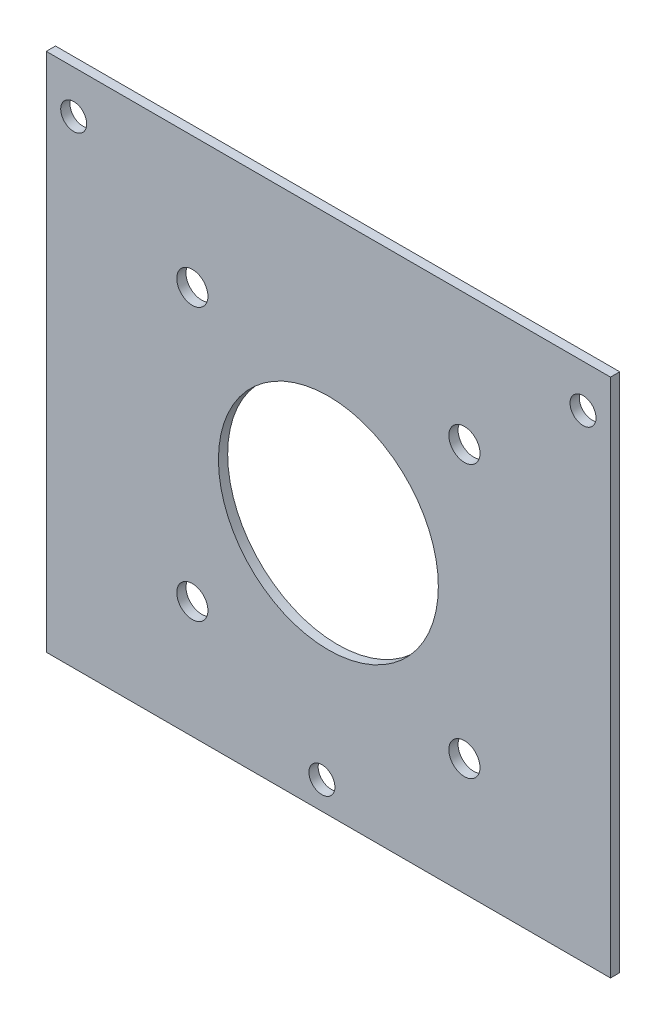
ISO-10303-21;
HEADER;
FILE_DESCRIPTION(('STEP AP214'),'2;1');
FILE_NAME('part.step','',(''),(''),'','','');
FILE_SCHEMA(('AUTOMOTIVE_DESIGN { 1 0 10303 214 1 1 1 1 }'));
ENDSEC;
DATA;
#1=APPLICATION_CONTEXT('core data for automotive mechanical design processes');
#2=APPLICATION_PROTOCOL_DEFINITION('international standard','automotive_design',2000,#1);
#3=PRODUCT_CONTEXT('',#1,'mechanical');
#4=PRODUCT('Part','Part','',(#3));
#5=PRODUCT_RELATED_PRODUCT_CATEGORY('part','',(#4));
#6=PRODUCT_DEFINITION_FORMATION('','',#4);
#7=PRODUCT_DEFINITION_CONTEXT('part definition',#1,'design');
#8=PRODUCT_DEFINITION('design','',#6,#7);
#9=PRODUCT_DEFINITION_SHAPE('','',#8);
#10=(LENGTH_UNIT() NAMED_UNIT(*) SI_UNIT(.MILLI.,.METRE.));
#11=(NAMED_UNIT(*) PLANE_ANGLE_UNIT() SI_UNIT($,.RADIAN.));
#12=(NAMED_UNIT(*) SI_UNIT($,.STERADIAN.) SOLID_ANGLE_UNIT());
#13=UNCERTAINTY_MEASURE_WITH_UNIT(LENGTH_MEASURE(1.E-05),#10,'distance_accuracy_value','');
#14=(GEOMETRIC_REPRESENTATION_CONTEXT(3) GLOBAL_UNCERTAINTY_ASSIGNED_CONTEXT((#13)) GLOBAL_UNIT_ASSIGNED_CONTEXT((#10,
#11,#12)) REPRESENTATION_CONTEXT('',''));
#15=CARTESIAN_POINT('',(0.,0.,0.));
#16=DIRECTION('',(0.,0.,1.));
#17=DIRECTION('',(1.,0.,0.));
#18=AXIS2_PLACEMENT_3D('',#15,#16,#17);
#19=CARTESIAN_POINT('',(48.88,-45.08,1.6));
#20=DIRECTION('',(-1.,0.,0.));
#21=DIRECTION('',(0.,0.,1.));
#22=AXIS2_PLACEMENT_3D('',#19,#20,#21);
#23=PLANE('',#22);
#24=DIRECTION('',(0.,1.,0.));
#25=VECTOR('',#24,1.);
#26=CARTESIAN_POINT('',(48.88,-45.08,0.));
#27=LINE('',#26,#25);
#28=CARTESIAN_POINT('',(48.88,-45.08,0.));
#29=VERTEX_POINT('',#28);
#30=CARTESIAN_POINT('',(48.88,45.08,0.));
#31=VERTEX_POINT('',#30);
#32=EDGE_CURVE('E95',#29,#31,#27,.T.);
#33=ORIENTED_EDGE('',*,*,#32,.T.);
#34=DIRECTION('',(0.,0.,-1.));
#35=VECTOR('',#34,1.);
#36=CARTESIAN_POINT('',(48.88,45.08,1.6));
#37=LINE('',#36,#35);
#38=CARTESIAN_POINT('',(48.88,45.08,1.6));
#39=VERTEX_POINT('',#38);
#40=EDGE_CURVE('E11',#39,#31,#37,.T.);
#41=ORIENTED_EDGE('',*,*,#40,.F.);
#42=DIRECTION('',(0.,1.,0.));
#43=VECTOR('',#42,1.);
#44=CARTESIAN_POINT('',(48.88,-45.08,1.6));
#45=LINE('',#44,#43);
#46=CARTESIAN_POINT('',(48.88,-45.08,1.6));
#47=VERTEX_POINT('',#46);
#48=EDGE_CURVE('E83',#47,#39,#45,.T.);
#49=ORIENTED_EDGE('',*,*,#48,.F.);
#50=DIRECTION('',(0.,0.,-1.));
#51=VECTOR('',#50,1.);
#52=CARTESIAN_POINT('',(48.88,-45.08,1.6));
#53=LINE('',#52,#51);
#54=EDGE_CURVE('E91',#47,#29,#53,.T.);
#55=ORIENTED_EDGE('',*,*,#54,.T.);
#56=EDGE_LOOP('',(#33,#41,#49,#55));
#57=FACE_BOUND('',#56,.T.);
#58=ADVANCED_FACE('F32',(#57),#23,.F.);
#59=CARTESIAN_POINT('',(-48.88,45.08,1.6));
#60=DIRECTION('',(0.,-1.,0.));
#61=DIRECTION('',(0.,0.,-1.));
#62=AXIS2_PLACEMENT_3D('',#59,#60,#61);
#63=PLANE('',#62);
#64=DIRECTION('',(-1.,0.,0.));
#65=VECTOR('',#64,1.);
#66=CARTESIAN_POINT('',(-48.88,45.08,0.));
#67=LINE('',#66,#65);
#68=CARTESIAN_POINT('',(-48.88,45.08,0.));
#69=VERTEX_POINT('',#68);
#70=EDGE_CURVE('E87',#31,#69,#67,.T.);
#71=ORIENTED_EDGE('',*,*,#70,.T.);
#72=DIRECTION('',(0.,0.,-1.));
#73=VECTOR('',#72,1.);
#74=CARTESIAN_POINT('',(-48.88,45.08,1.6));
#75=LINE('',#74,#73);
#76=CARTESIAN_POINT('',(-48.88,45.08,1.6));
#77=VERTEX_POINT('',#76);
#78=EDGE_CURVE('E40',#77,#69,#75,.T.);
#79=ORIENTED_EDGE('',*,*,#78,.F.);
#80=DIRECTION('',(-1.,0.,0.));
#81=VECTOR('',#80,1.);
#82=CARTESIAN_POINT('',(-48.88,45.08,1.6));
#83=LINE('',#82,#81);
#84=EDGE_CURVE('E78',#39,#77,#83,.T.);
#85=ORIENTED_EDGE('',*,*,#84,.F.);
#86=ORIENTED_EDGE('',*,*,#40,.T.);
#87=EDGE_LOOP('',(#71,#79,#85,#86));
#88=FACE_BOUND('',#87,.T.);
#89=ADVANCED_FACE('F86',(#88),#63,.F.);
#90=CARTESIAN_POINT('',(-48.88,-45.08,1.6));
#91=DIRECTION('',(1.,0.,0.));
#92=DIRECTION('',(0.,0.,-1.));
#93=AXIS2_PLACEMENT_3D('',#90,#91,#92);
#94=PLANE('',#93);
#95=DIRECTION('',(0.,-1.,0.));
#96=VECTOR('',#95,1.);
#97=CARTESIAN_POINT('',(-48.88,-45.08,0.));
#98=LINE('',#97,#96);
#99=CARTESIAN_POINT('',(-48.88,-45.08,0.));
#100=VERTEX_POINT('',#99);
#101=EDGE_CURVE('E65',#69,#100,#98,.T.);
#102=ORIENTED_EDGE('',*,*,#101,.T.);
#103=DIRECTION('',(0.,0.,-1.));
#104=VECTOR('',#103,1.);
#105=CARTESIAN_POINT('',(-48.88,-45.08,1.6));
#106=LINE('',#105,#104);
#107=CARTESIAN_POINT('',(-48.88,-45.08,1.6));
#108=VERTEX_POINT('',#107);
#109=EDGE_CURVE('E88',#108,#100,#106,.T.);
#110=ORIENTED_EDGE('',*,*,#109,.F.);
#111=DIRECTION('',(0.,-1.,0.));
#112=VECTOR('',#111,1.);
#113=CARTESIAN_POINT('',(-48.88,-45.08,1.6));
#114=LINE('',#113,#112);
#115=EDGE_CURVE('E81',#77,#108,#114,.T.);
#116=ORIENTED_EDGE('',*,*,#115,.F.);
#117=ORIENTED_EDGE('',*,*,#78,.T.);
#118=EDGE_LOOP('',(#102,#110,#116,#117));
#119=FACE_BOUND('',#118,.T.);
#120=ADVANCED_FACE('F89',(#119),#94,.F.);
#121=CARTESIAN_POINT('',(-48.88,-45.08,1.6));
#122=DIRECTION('',(0.,1.,0.));
#123=DIRECTION('',(0.,0.,1.));
#124=AXIS2_PLACEMENT_3D('',#121,#122,#123);
#125=PLANE('',#124);
#126=DIRECTION('',(1.,0.,0.));
#127=VECTOR('',#126,1.);
#128=CARTESIAN_POINT('',(-48.88,-45.08,0.));
#129=LINE('',#128,#127);
#130=EDGE_CURVE('E71',#100,#29,#129,.T.);
#131=ORIENTED_EDGE('',*,*,#130,.T.);
#132=ORIENTED_EDGE('',*,*,#54,.F.);
#133=DIRECTION('',(1.,0.,0.));
#134=VECTOR('',#133,1.);
#135=CARTESIAN_POINT('',(-48.88,-45.08,1.6));
#136=LINE('',#135,#134);
#137=EDGE_CURVE('E48',#108,#47,#136,.T.);
#138=ORIENTED_EDGE('',*,*,#137,.F.);
#139=ORIENTED_EDGE('',*,*,#109,.T.);
#140=EDGE_LOOP('',(#131,#132,#138,#139));
#141=FACE_BOUND('',#140,.T.);
#142=ADVANCED_FACE('F103',(#141),#125,.F.);
#143=CARTESIAN_POINT('',(48.88,45.08,1.6));
#144=DIRECTION('',(0.,0.,-1.));
#145=DIRECTION('',(-1.,0.,0.));
#146=AXIS2_PLACEMENT_3D('',#143,#144,#145);
#147=PLANE('',#146);
#148=CARTESIAN_POINT('',(-23.57,-24.82,1.6));
#149=DIRECTION('',(0.,0.,1.));
#150=DIRECTION('',(1.,0.,0.));
#151=AXIS2_PLACEMENT_3D('',#148,#149,#150);
#152=CIRCLE('',#151,2.7);
#153=CARTESIAN_POINT('',(-20.87,-24.82,1.6));
#154=VERTEX_POINT('',#153);
#155=EDGE_CURVE('E148',#154,#154,#152,.T.);
#156=ORIENTED_EDGE('',*,*,#155,.F.);
#157=EDGE_LOOP('',(#156));
#158=FACE_BOUND('',#157,.T.);
#159=CARTESIAN_POINT('',(23.57,-24.82,1.6));
#160=DIRECTION('',(0.,0.,1.));
#161=DIRECTION('',(1.,0.,0.));
#162=AXIS2_PLACEMENT_3D('',#159,#160,#161);
#163=CIRCLE('',#162,2.7);
#164=CARTESIAN_POINT('',(26.27,-24.82,1.6));
#165=VERTEX_POINT('',#164);
#166=EDGE_CURVE('E142',#165,#165,#163,.T.);
#167=ORIENTED_EDGE('',*,*,#166,.F.);
#168=EDGE_LOOP('',(#167));
#169=FACE_BOUND('',#168,.T.);
#170=CARTESIAN_POINT('',(23.57,22.32,1.6));
#171=DIRECTION('',(0.,0.,1.));
#172=DIRECTION('',(1.,0.,0.));
#173=AXIS2_PLACEMENT_3D('',#170,#171,#172);
#174=CIRCLE('',#173,2.7);
#175=CARTESIAN_POINT('',(26.27,22.32,1.6));
#176=VERTEX_POINT('',#175);
#177=EDGE_CURVE('E136',#176,#176,#174,.T.);
#178=ORIENTED_EDGE('',*,*,#177,.F.);
#179=EDGE_LOOP('',(#178));
#180=FACE_BOUND('',#179,.T.);
#181=CARTESIAN_POINT('',(-23.57,22.32,1.6));
#182=DIRECTION('',(0.,0.,1.));
#183=DIRECTION('',(1.,0.,0.));
#184=AXIS2_PLACEMENT_3D('',#181,#182,#183);
#185=CIRCLE('',#184,2.7);
#186=CARTESIAN_POINT('',(-20.87,22.32,1.6));
#187=VERTEX_POINT('',#186);
#188=EDGE_CURVE('E130',#187,#187,#185,.T.);
#189=ORIENTED_EDGE('',*,*,#188,.F.);
#190=EDGE_LOOP('',(#189));
#191=FACE_BOUND('',#190,.T.);
#192=CARTESIAN_POINT('',(0.,-1.24999999999999,1.6));
#193=DIRECTION('',(0.,0.,1.));
#194=DIRECTION('',(1.,0.,0.));
#195=AXIS2_PLACEMENT_3D('',#192,#193,#194);
#196=CIRCLE('',#195,19.05);
#197=CARTESIAN_POINT('',(19.05,-1.24999999999999,1.6));
#198=VERTEX_POINT('',#197);
#199=EDGE_CURVE('E126',#198,#198,#196,.T.);
#200=ORIENTED_EDGE('',*,*,#199,.F.);
#201=EDGE_LOOP('',(#200));
#202=FACE_BOUND('',#201,.T.);
#203=CARTESIAN_POINT('',(44.12,37.68,1.6));
#204=DIRECTION('',(0.,0.,1.));
#205=DIRECTION('',(1.,0.,0.));
#206=AXIS2_PLACEMENT_3D('',#203,#204,#205);
#207=CIRCLE('',#206,2.24999999999999);
#208=CARTESIAN_POINT('',(46.37,37.68,1.6));
#209=VERTEX_POINT('',#208);
#210=EDGE_CURVE('E123',#209,#209,#207,.T.);
#211=ORIENTED_EDGE('',*,*,#210,.F.);
#212=EDGE_LOOP('',(#211));
#213=FACE_BOUND('',#212,.T.);
#214=CARTESIAN_POINT('',(-1.12,-40.32,1.6));
#215=DIRECTION('',(0.,0.,1.));
#216=DIRECTION('',(1.,0.,0.));
#217=AXIS2_PLACEMENT_3D('',#214,#215,#216);
#218=CIRCLE('',#217,2.24999999999999);
#219=CARTESIAN_POINT('',(1.12999999999999,-40.32,1.6));
#220=VERTEX_POINT('',#219);
#221=EDGE_CURVE('E117',#220,#220,#218,.T.);
#222=ORIENTED_EDGE('',*,*,#221,.F.);
#223=EDGE_LOOP('',(#222));
#224=FACE_BOUND('',#223,.T.);
#225=CARTESIAN_POINT('',(-44.1234000000005,37.68,1.6));
#226=DIRECTION('',(0.,0.,1.));
#227=DIRECTION('',(1.,0.,0.));
#228=AXIS2_PLACEMENT_3D('',#225,#226,#227);
#229=CIRCLE('',#228,2.24999999999999);
#230=CARTESIAN_POINT('',(-41.8734000000005,37.68,1.6));
#231=VERTEX_POINT('',#230);
#232=EDGE_CURVE('E111',#231,#231,#229,.T.);
#233=ORIENTED_EDGE('',*,*,#232,.F.);
#234=EDGE_LOOP('',(#233));
#235=FACE_BOUND('',#234,.T.);
#236=ORIENTED_EDGE('',*,*,#48,.T.);
#237=ORIENTED_EDGE('',*,*,#84,.T.);
#238=ORIENTED_EDGE('',*,*,#115,.T.);
#239=ORIENTED_EDGE('',*,*,#137,.T.);
#240=EDGE_LOOP('',(#236,#237,#238,#239));
#241=FACE_BOUND('',#240,.T.);
#242=ADVANCED_FACE('F79',(#158,#169,#180,#191,#202,#213,#224,#235,#241),#147,.F.);
#243=CARTESIAN_POINT('',(48.88,45.08,0.));
#244=DIRECTION('',(0.,0.,-1.));
#245=DIRECTION('',(-1.,0.,0.));
#246=AXIS2_PLACEMENT_3D('',#243,#244,#245);
#247=PLANE('',#246);
#248=CARTESIAN_POINT('',(-23.57,-24.82,0.));
#249=DIRECTION('',(0.,0.,-1.));
#250=DIRECTION('',(-1.,0.,0.));
#251=AXIS2_PLACEMENT_3D('',#248,#249,#250);
#252=CIRCLE('',#251,2.7);
#253=CARTESIAN_POINT('',(-26.27,-24.82,0.));
#254=VERTEX_POINT('',#253);
#255=EDGE_CURVE('E151',#254,#254,#252,.F.);
#256=ORIENTED_EDGE('',*,*,#255,.T.);
#257=EDGE_LOOP('',(#256));
#258=FACE_BOUND('',#257,.T.);
#259=CARTESIAN_POINT('',(23.57,-24.82,0.));
#260=DIRECTION('',(0.,0.,-1.));
#261=DIRECTION('',(-1.,0.,0.));
#262=AXIS2_PLACEMENT_3D('',#259,#260,#261);
#263=CIRCLE('',#262,2.7);
#264=CARTESIAN_POINT('',(20.87,-24.82,0.));
#265=VERTEX_POINT('',#264);
#266=EDGE_CURVE('E145',#265,#265,#263,.F.);
#267=ORIENTED_EDGE('',*,*,#266,.T.);
#268=EDGE_LOOP('',(#267));
#269=FACE_BOUND('',#268,.T.);
#270=CARTESIAN_POINT('',(23.57,22.32,0.));
#271=DIRECTION('',(0.,0.,-1.));
#272=DIRECTION('',(-1.,0.,0.));
#273=AXIS2_PLACEMENT_3D('',#270,#271,#272);
#274=CIRCLE('',#273,2.7);
#275=CARTESIAN_POINT('',(20.87,22.32,0.));
#276=VERTEX_POINT('',#275);
#277=EDGE_CURVE('E139',#276,#276,#274,.F.);
#278=ORIENTED_EDGE('',*,*,#277,.T.);
#279=EDGE_LOOP('',(#278));
#280=FACE_BOUND('',#279,.T.);
#281=CARTESIAN_POINT('',(-23.57,22.32,0.));
#282=DIRECTION('',(0.,0.,-1.));
#283=DIRECTION('',(-1.,0.,0.));
#284=AXIS2_PLACEMENT_3D('',#281,#282,#283);
#285=CIRCLE('',#284,2.7);
#286=CARTESIAN_POINT('',(-26.27,22.32,0.));
#287=VERTEX_POINT('',#286);
#288=EDGE_CURVE('E133',#287,#287,#285,.F.);
#289=ORIENTED_EDGE('',*,*,#288,.T.);
#290=EDGE_LOOP('',(#289));
#291=FACE_BOUND('',#290,.T.);
#292=CARTESIAN_POINT('',(0.,-1.24999999999999,0.));
#293=DIRECTION('',(0.,0.,-1.));
#294=DIRECTION('',(-1.,0.,0.));
#295=AXIS2_PLACEMENT_3D('',#292,#293,#294);
#296=CIRCLE('',#295,19.05);
#297=CARTESIAN_POINT('',(-19.05,-1.24999999999999,0.));
#298=VERTEX_POINT('',#297);
#299=EDGE_CURVE('E127',#298,#298,#296,.F.);
#300=ORIENTED_EDGE('',*,*,#299,.T.);
#301=EDGE_LOOP('',(#300));
#302=FACE_BOUND('',#301,.T.);
#303=CARTESIAN_POINT('',(44.12,37.68,0.));
#304=DIRECTION('',(0.,0.,1.));
#305=DIRECTION('',(1.,0.,0.));
#306=AXIS2_PLACEMENT_3D('',#303,#304,#305);
#307=CIRCLE('',#306,2.25);
#308=CARTESIAN_POINT('',(46.37,37.68,0.));
#309=VERTEX_POINT('',#308);
#310=EDGE_CURVE('E120',#309,#309,#307,.T.);
#311=ORIENTED_EDGE('',*,*,#310,.T.);
#312=EDGE_LOOP('',(#311));
#313=FACE_BOUND('',#312,.T.);
#314=CARTESIAN_POINT('',(-1.12,-40.32,0.));
#315=DIRECTION('',(0.,0.,1.));
#316=DIRECTION('',(1.,0.,0.));
#317=AXIS2_PLACEMENT_3D('',#314,#315,#316);
#318=CIRCLE('',#317,2.25);
#319=CARTESIAN_POINT('',(1.13,-40.32,0.));
#320=VERTEX_POINT('',#319);
#321=EDGE_CURVE('E114',#320,#320,#318,.T.);
#322=ORIENTED_EDGE('',*,*,#321,.T.);
#323=EDGE_LOOP('',(#322));
#324=FACE_BOUND('',#323,.T.);
#325=CARTESIAN_POINT('',(-44.1234000000005,37.68,0.));
#326=DIRECTION('',(0.,0.,1.));
#327=DIRECTION('',(1.,0.,0.));
#328=AXIS2_PLACEMENT_3D('',#325,#326,#327);
#329=CIRCLE('',#328,2.25);
#330=CARTESIAN_POINT('',(-41.8734000000005,37.68,0.));
#331=VERTEX_POINT('',#330);
#332=EDGE_CURVE('E98',#331,#331,#329,.T.);
#333=ORIENTED_EDGE('',*,*,#332,.T.);
#334=EDGE_LOOP('',(#333));
#335=FACE_BOUND('',#334,.T.);
#336=ORIENTED_EDGE('',*,*,#32,.F.);
#337=ORIENTED_EDGE('',*,*,#130,.F.);
#338=ORIENTED_EDGE('',*,*,#101,.F.);
#339=ORIENTED_EDGE('',*,*,#70,.F.);
#340=EDGE_LOOP('',(#336,#337,#338,#339));
#341=FACE_BOUND('',#340,.T.);
#342=ADVANCED_FACE('F106',(#258,#269,#280,#291,#302,#313,#324,#335,#341),#247,.T.);
#343=CARTESIAN_POINT('',(-44.1234000000005,37.68,1.6));
#344=DIRECTION('',(0.,0.,1.));
#345=DIRECTION('',(1.,0.,0.));
#346=AXIS2_PLACEMENT_3D('',#343,#344,#345);
#347=CYLINDRICAL_SURFACE('',#346,2.25);
#348=ORIENTED_EDGE('',*,*,#332,.F.);
#349=EDGE_LOOP('',(#348));
#350=FACE_BOUND('',#349,.T.);
#351=ORIENTED_EDGE('',*,*,#232,.T.);
#352=EDGE_LOOP('',(#351));
#353=FACE_BOUND('',#352,.T.);
#354=ADVANCED_FACE('F176',(#350,#353),#347,.F.);
#355=CARTESIAN_POINT('',(-1.12,-40.32,1.6));
#356=DIRECTION('',(0.,0.,1.));
#357=DIRECTION('',(1.,0.,0.));
#358=AXIS2_PLACEMENT_3D('',#355,#356,#357);
#359=CYLINDRICAL_SURFACE('',#358,2.24999999999999);
#360=ORIENTED_EDGE('',*,*,#321,.F.);
#361=EDGE_LOOP('',(#360));
#362=FACE_BOUND('',#361,.T.);
#363=ORIENTED_EDGE('',*,*,#221,.T.);
#364=EDGE_LOOP('',(#363));
#365=FACE_BOUND('',#364,.T.);
#366=ADVANCED_FACE('F178',(#362,#365),#359,.F.);
#367=CARTESIAN_POINT('',(44.12,37.68,1.6));
#368=DIRECTION('',(0.,0.,1.));
#369=DIRECTION('',(1.,0.,0.));
#370=AXIS2_PLACEMENT_3D('',#367,#368,#369);
#371=CYLINDRICAL_SURFACE('',#370,2.25);
#372=ORIENTED_EDGE('',*,*,#310,.F.);
#373=EDGE_LOOP('',(#372));
#374=FACE_BOUND('',#373,.T.);
#375=ORIENTED_EDGE('',*,*,#210,.T.);
#376=EDGE_LOOP('',(#375));
#377=FACE_BOUND('',#376,.T.);
#378=ADVANCED_FACE('F185',(#374,#377),#371,.F.);
#379=CARTESIAN_POINT('',(0.,-1.24999999999999,-0.000999999999999916));
#380=DIRECTION('',(0.,0.,1.));
#381=DIRECTION('',(1.,0.,0.));
#382=AXIS2_PLACEMENT_3D('',#379,#380,#381);
#383=CYLINDRICAL_SURFACE('',#382,19.05);
#384=ORIENTED_EDGE('',*,*,#299,.F.);
#385=EDGE_LOOP('',(#384));
#386=FACE_BOUND('',#385,.T.);
#387=ORIENTED_EDGE('',*,*,#199,.T.);
#388=EDGE_LOOP('',(#387));
#389=FACE_BOUND('',#388,.T.);
#390=ADVANCED_FACE('F221',(#386,#389),#383,.F.);
#391=CARTESIAN_POINT('',(-23.57,22.32,-0.000999999999999916));
#392=DIRECTION('',(0.,0.,1.));
#393=DIRECTION('',(1.,0.,0.));
#394=AXIS2_PLACEMENT_3D('',#391,#392,#393);
#395=CYLINDRICAL_SURFACE('',#394,2.7);
#396=ORIENTED_EDGE('',*,*,#288,.F.);
#397=EDGE_LOOP('',(#396));
#398=FACE_BOUND('',#397,.T.);
#399=ORIENTED_EDGE('',*,*,#188,.T.);
#400=EDGE_LOOP('',(#399));
#401=FACE_BOUND('',#400,.T.);
#402=ADVANCED_FACE('F226',(#398,#401),#395,.F.);
#403=CARTESIAN_POINT('',(23.57,22.32,-0.000999999999999916));
#404=DIRECTION('',(0.,0.,1.));
#405=DIRECTION('',(1.,0.,0.));
#406=AXIS2_PLACEMENT_3D('',#403,#404,#405);
#407=CYLINDRICAL_SURFACE('',#406,2.7);
#408=ORIENTED_EDGE('',*,*,#277,.F.);
#409=EDGE_LOOP('',(#408));
#410=FACE_BOUND('',#409,.T.);
#411=ORIENTED_EDGE('',*,*,#177,.T.);
#412=EDGE_LOOP('',(#411));
#413=FACE_BOUND('',#412,.T.);
#414=ADVANCED_FACE('F239',(#410,#413),#407,.F.);
#415=CARTESIAN_POINT('',(23.57,-24.82,-0.000999999999999916));
#416=DIRECTION('',(0.,0.,1.));
#417=DIRECTION('',(1.,0.,0.));
#418=AXIS2_PLACEMENT_3D('',#415,#416,#417);
#419=CYLINDRICAL_SURFACE('',#418,2.7);
#420=ORIENTED_EDGE('',*,*,#266,.F.);
#421=EDGE_LOOP('',(#420));
#422=FACE_BOUND('',#421,.T.);
#423=ORIENTED_EDGE('',*,*,#166,.T.);
#424=EDGE_LOOP('',(#423));
#425=FACE_BOUND('',#424,.T.);
#426=ADVANCED_FACE('F250',(#422,#425),#419,.F.);
#427=CARTESIAN_POINT('',(-23.57,-24.82,-0.000999999999999916));
#428=DIRECTION('',(0.,0.,1.));
#429=DIRECTION('',(1.,0.,0.));
#430=AXIS2_PLACEMENT_3D('',#427,#428,#429);
#431=CYLINDRICAL_SURFACE('',#430,2.7);
#432=ORIENTED_EDGE('',*,*,#255,.F.);
#433=EDGE_LOOP('',(#432));
#434=FACE_BOUND('',#433,.T.);
#435=ORIENTED_EDGE('',*,*,#155,.T.);
#436=EDGE_LOOP('',(#435));
#437=FACE_BOUND('',#436,.T.);
#438=ADVANCED_FACE('F157',(#434,#437),#431,.F.);
#439=CLOSED_SHELL('',(#58,#89,#120,#142,#242,#342,#354,#366,#378,#390,#402,#414,#426,#438));
#440=MANIFOLD_SOLID_BREP('B2',#439);
#441=ADVANCED_BREP_SHAPE_REPRESENTATION('',(#18,#440),#14);
#442=SHAPE_DEFINITION_REPRESENTATION(#9,#441);
ENDSEC;
END-ISO-10303-21;
